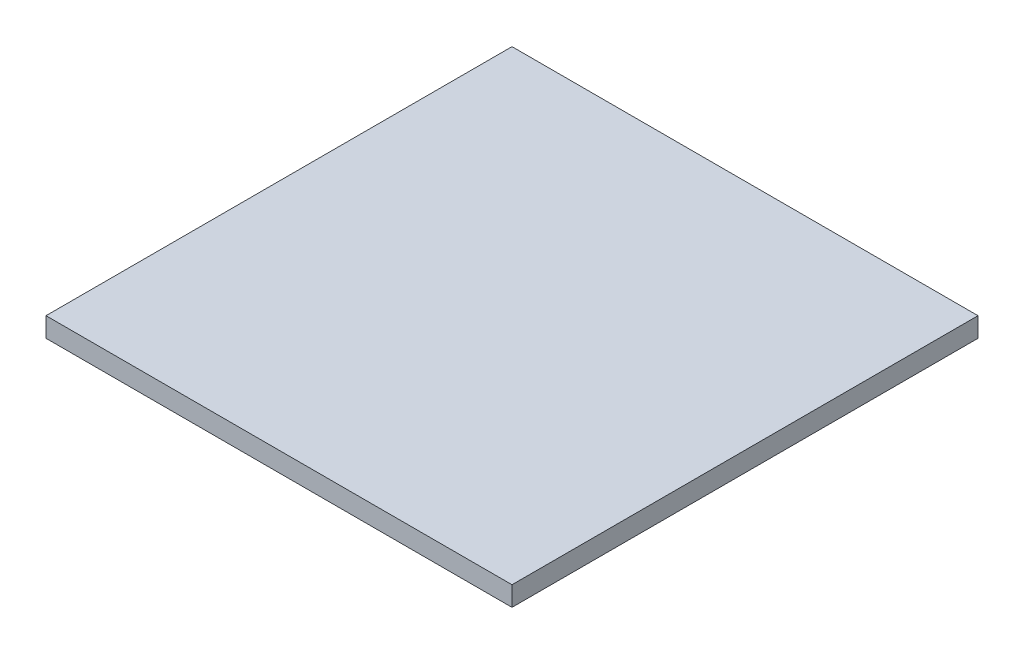
ISO-10303-21;
HEADER;
FILE_DESCRIPTION(('STEP AP214'),'2;1');
FILE_NAME('part.step','',(''),(''),'','','');
FILE_SCHEMA(('AUTOMOTIVE_DESIGN { 1 0 10303 214 1 1 1 1 }'));
ENDSEC;
DATA;
#1=APPLICATION_CONTEXT('core data for automotive mechanical design processes');
#2=APPLICATION_PROTOCOL_DEFINITION('international standard','automotive_design',2000,#1);
#3=PRODUCT_CONTEXT('',#1,'mechanical');
#4=PRODUCT('Part','Part','',(#3));
#5=PRODUCT_RELATED_PRODUCT_CATEGORY('part','',(#4));
#6=PRODUCT_DEFINITION_FORMATION('','',#4);
#7=PRODUCT_DEFINITION_CONTEXT('part definition',#1,'design');
#8=PRODUCT_DEFINITION('design','',#6,#7);
#9=PRODUCT_DEFINITION_SHAPE('','',#8);
#10=(LENGTH_UNIT() NAMED_UNIT(*) SI_UNIT(.MILLI.,.METRE.));
#11=(NAMED_UNIT(*) PLANE_ANGLE_UNIT() SI_UNIT($,.RADIAN.));
#12=(NAMED_UNIT(*) SI_UNIT($,.STERADIAN.) SOLID_ANGLE_UNIT());
#13=UNCERTAINTY_MEASURE_WITH_UNIT(LENGTH_MEASURE(1.E-05),#10,'distance_accuracy_value','');
#14=(GEOMETRIC_REPRESENTATION_CONTEXT(3) GLOBAL_UNCERTAINTY_ASSIGNED_CONTEXT((#13)) GLOBAL_UNIT_ASSIGNED_CONTEXT((#10,
#11,#12)) REPRESENTATION_CONTEXT('',''));
#15=CARTESIAN_POINT('',(0.,0.,0.));
#16=DIRECTION('',(0.,0.,1.));
#17=DIRECTION('',(1.,0.,0.));
#18=AXIS2_PLACEMENT_3D('',#15,#16,#17);
#19=CARTESIAN_POINT('',(0.,0.,0.));
#20=DIRECTION('',(0.,-1.,0.));
#21=DIRECTION('',(0.,0.,-1.));
#22=AXIS2_PLACEMENT_3D('',#19,#20,#21);
#23=PLANE('',#22);
#24=DIRECTION('',(-1.,0.,0.));
#25=VECTOR('',#24,1.);
#26=CARTESIAN_POINT('',(-2.00000000000005,0.,-254.080415622193));
#27=LINE('',#26,#25);
#28=CARTESIAN_POINT('',(402.,0.,-254.080415622193));
#29=VERTEX_POINT('',#28);
#30=CARTESIAN_POINT('',(-2.00000000000005,0.,-254.080415622193));
#31=VERTEX_POINT('',#30);
#32=EDGE_CURVE('E181',#29,#31,#27,.T.);
#33=ORIENTED_EDGE('',*,*,#32,.F.);
#34=DIRECTION('',(0.,0.,-1.));
#35=VECTOR('',#34,1.);
#36=CARTESIAN_POINT('',(402.,0.,-254.080415622193));
#37=LINE('',#36,#35);
#38=CARTESIAN_POINT('',(402.,0.,149.919584377807));
#39=VERTEX_POINT('',#38);
#40=EDGE_CURVE('E65',#39,#29,#37,.T.);
#41=ORIENTED_EDGE('',*,*,#40,.F.);
#42=DIRECTION('',(1.,0.,0.));
#43=VECTOR('',#42,1.);
#44=CARTESIAN_POINT('',(-2.,0.,149.919584377807));
#45=LINE('',#44,#43);
#46=CARTESIAN_POINT('',(-2.,0.,149.919584377807));
#47=VERTEX_POINT('',#46);
#48=EDGE_CURVE('E187',#47,#39,#45,.T.);
#49=ORIENTED_EDGE('',*,*,#48,.F.);
#50=DIRECTION('',(0.,0.,1.));
#51=VECTOR('',#50,1.);
#52=CARTESIAN_POINT('',(-2.00000000000005,0.,-254.080415622193));
#53=LINE('',#52,#51);
#54=EDGE_CURVE('E114',#31,#47,#53,.T.);
#55=ORIENTED_EDGE('',*,*,#54,.F.);
#56=EDGE_LOOP('',(#33,#41,#49,#55));
#57=FACE_BOUND('',#56,.T.);
#58=DIRECTION('',(-1.,0.,0.));
#59=VECTOR('',#58,1.);
#60=CARTESIAN_POINT('',(0.,0.,-252.080415622193));
#61=LINE('',#60,#59);
#62=CARTESIAN_POINT('',(400.,0.,-252.080415622193));
#63=VERTEX_POINT('',#62);
#64=CARTESIAN_POINT('',(0.,0.,-252.080415622193));
#65=VERTEX_POINT('',#64);
#66=EDGE_CURVE('E144',#63,#65,#61,.T.);
#67=ORIENTED_EDGE('',*,*,#66,.T.);
#68=DIRECTION('',(0.,0.,1.));
#69=VECTOR('',#68,1.);
#70=CARTESIAN_POINT('',(0.,0.,-252.080415622193));
#71=LINE('',#70,#69);
#72=CARTESIAN_POINT('',(0.,0.,147.919584377807));
#73=VERTEX_POINT('',#72);
#74=EDGE_CURVE('E57',#65,#73,#71,.T.);
#75=ORIENTED_EDGE('',*,*,#74,.T.);
#76=DIRECTION('',(1.,0.,0.));
#77=VECTOR('',#76,1.);
#78=CARTESIAN_POINT('',(0.,0.,147.919584377807));
#79=LINE('',#78,#77);
#80=CARTESIAN_POINT('',(400.,0.,147.919584377807));
#81=VERTEX_POINT('',#80);
#82=EDGE_CURVE('E159',#73,#81,#79,.T.);
#83=ORIENTED_EDGE('',*,*,#82,.T.);
#84=DIRECTION('',(0.,0.,-1.));
#85=VECTOR('',#84,1.);
#86=CARTESIAN_POINT('',(400.,0.,-252.080415622193));
#87=LINE('',#86,#85);
#88=EDGE_CURVE('E163',#81,#63,#87,.T.);
#89=ORIENTED_EDGE('',*,*,#88,.T.);
#90=EDGE_LOOP('',(#67,#75,#83,#89));
#91=FACE_BOUND('',#90,.T.);
#92=ADVANCED_FACE('F41',(#57,#91),#23,.T.);
#93=CARTESIAN_POINT('',(-2.00000000000005,15.,-254.080415622193));
#94=DIRECTION('',(0.,0.,1.));
#95=DIRECTION('',(1.,0.,0.));
#96=AXIS2_PLACEMENT_3D('',#93,#94,#95);
#97=PLANE('',#96);
#98=ORIENTED_EDGE('',*,*,#32,.T.);
#99=DIRECTION('',(0.,-1.,0.));
#100=VECTOR('',#99,1.);
#101=CARTESIAN_POINT('',(-2.00000000000005,15.,-254.080415622193));
#102=LINE('',#101,#100);
#103=CARTESIAN_POINT('',(-2.00000000000005,17.,-254.080415622193));
#104=VERTEX_POINT('',#103);
#105=EDGE_CURVE('E11',#104,#31,#102,.T.);
#106=ORIENTED_EDGE('',*,*,#105,.F.);
#107=DIRECTION('',(-1.,0.,0.));
#108=VECTOR('',#107,1.);
#109=CARTESIAN_POINT('',(-2.00000000000005,17.,-254.080415622193));
#110=LINE('',#109,#108);
#111=CARTESIAN_POINT('',(402.,17.,-254.080415622193));
#112=VERTEX_POINT('',#111);
#113=EDGE_CURVE('E131',#112,#104,#110,.T.);
#114=ORIENTED_EDGE('',*,*,#113,.F.);
#115=DIRECTION('',(0.,-1.,0.));
#116=VECTOR('',#115,1.);
#117=CARTESIAN_POINT('',(402.,15.,-254.080415622193));
#118=LINE('',#117,#116);
#119=EDGE_CURVE('E192',#112,#29,#118,.T.);
#120=ORIENTED_EDGE('',*,*,#119,.T.);
#121=EDGE_LOOP('',(#98,#106,#114,#120));
#122=FACE_BOUND('',#121,.T.);
#123=ADVANCED_FACE('F43',(#122),#97,.F.);
#124=CARTESIAN_POINT('',(-2.00000000000005,15.,-254.080415622193));
#125=DIRECTION('',(1.,0.,0.));
#126=DIRECTION('',(0.,0.,-1.));
#127=AXIS2_PLACEMENT_3D('',#124,#125,#126);
#128=PLANE('',#127);
#129=ORIENTED_EDGE('',*,*,#54,.T.);
#130=DIRECTION('',(0.,-1.,0.));
#131=VECTOR('',#130,1.);
#132=CARTESIAN_POINT('',(-2.,15.,149.919584377807));
#133=LINE('',#132,#131);
#134=CARTESIAN_POINT('',(-2.,17.,149.919584377807));
#135=VERTEX_POINT('',#134);
#136=EDGE_CURVE('E50',#135,#47,#133,.T.);
#137=ORIENTED_EDGE('',*,*,#136,.F.);
#138=DIRECTION('',(0.,0.,1.));
#139=VECTOR('',#138,1.);
#140=CARTESIAN_POINT('',(-2.00000000000005,17.,-254.080415622193));
#141=LINE('',#140,#139);
#142=EDGE_CURVE('E113',#104,#135,#141,.T.);
#143=ORIENTED_EDGE('',*,*,#142,.F.);
#144=ORIENTED_EDGE('',*,*,#105,.T.);
#145=EDGE_LOOP('',(#129,#137,#143,#144));
#146=FACE_BOUND('',#145,.T.);
#147=ADVANCED_FACE('F111',(#146),#128,.F.);
#148=CARTESIAN_POINT('',(-2.,15.,149.919584377807));
#149=DIRECTION('',(0.,0.,-1.));
#150=DIRECTION('',(-1.,0.,0.));
#151=AXIS2_PLACEMENT_3D('',#148,#149,#150);
#152=PLANE('',#151);
#153=ORIENTED_EDGE('',*,*,#48,.T.);
#154=DIRECTION('',(0.,-1.,0.));
#155=VECTOR('',#154,1.);
#156=CARTESIAN_POINT('',(402.,15.,149.919584377807));
#157=LINE('',#156,#155);
#158=CARTESIAN_POINT('',(402.,17.,149.919584377807));
#159=VERTEX_POINT('',#158);
#160=EDGE_CURVE('E118',#159,#39,#157,.T.);
#161=ORIENTED_EDGE('',*,*,#160,.F.);
#162=DIRECTION('',(1.,0.,0.));
#163=VECTOR('',#162,1.);
#164=CARTESIAN_POINT('',(-2.,17.,149.919584377807));
#165=LINE('',#164,#163);
#166=EDGE_CURVE('E120',#135,#159,#165,.T.);
#167=ORIENTED_EDGE('',*,*,#166,.F.);
#168=ORIENTED_EDGE('',*,*,#136,.T.);
#169=EDGE_LOOP('',(#153,#161,#167,#168));
#170=FACE_BOUND('',#169,.T.);
#171=ADVANCED_FACE('F121',(#170),#152,.F.);
#172=CARTESIAN_POINT('',(402.,15.,-254.080415622193));
#173=DIRECTION('',(-1.,0.,0.));
#174=DIRECTION('',(0.,0.,1.));
#175=AXIS2_PLACEMENT_3D('',#172,#173,#174);
#176=PLANE('',#175);
#177=ORIENTED_EDGE('',*,*,#40,.T.);
#178=ORIENTED_EDGE('',*,*,#119,.F.);
#179=DIRECTION('',(0.,0.,-1.));
#180=VECTOR('',#179,1.);
#181=CARTESIAN_POINT('',(402.,17.,-254.080415622193));
#182=LINE('',#181,#180);
#183=EDGE_CURVE('E126',#159,#112,#182,.T.);
#184=ORIENTED_EDGE('',*,*,#183,.F.);
#185=ORIENTED_EDGE('',*,*,#160,.T.);
#186=EDGE_LOOP('',(#177,#178,#184,#185));
#187=FACE_BOUND('',#186,.T.);
#188=ADVANCED_FACE('F196',(#187),#176,.F.);
#189=CARTESIAN_POINT('',(0.,15.,-252.080415622193));
#190=DIRECTION('',(1.,0.,0.));
#191=DIRECTION('',(0.,0.,-1.));
#192=AXIS2_PLACEMENT_3D('',#189,#190,#191);
#193=PLANE('',#192);
#194=ORIENTED_EDGE('',*,*,#74,.F.);
#195=DIRECTION('',(0.,-1.,0.));
#196=VECTOR('',#195,1.);
#197=CARTESIAN_POINT('',(0.,15.,-252.080415622193));
#198=LINE('',#197,#196);
#199=CARTESIAN_POINT('',(0.,15.,-252.080415622193));
#200=VERTEX_POINT('',#199);
#201=EDGE_CURVE('E156',#200,#65,#198,.T.);
#202=ORIENTED_EDGE('',*,*,#201,.F.);
#203=DIRECTION('',(0.,0.,1.));
#204=VECTOR('',#203,1.);
#205=CARTESIAN_POINT('',(0.,15.,-252.080415622193));
#206=LINE('',#205,#204);
#207=CARTESIAN_POINT('',(0.,15.,147.919584377807));
#208=VERTEX_POINT('',#207);
#209=EDGE_CURVE('E139',#200,#208,#206,.T.);
#210=ORIENTED_EDGE('',*,*,#209,.T.);
#211=DIRECTION('',(0.,-1.,0.));
#212=VECTOR('',#211,1.);
#213=CARTESIAN_POINT('',(0.,15.,147.919584377807));
#214=LINE('',#213,#212);
#215=EDGE_CURVE('E178',#208,#73,#214,.T.);
#216=ORIENTED_EDGE('',*,*,#215,.T.);
#217=EDGE_LOOP('',(#194,#202,#210,#216));
#218=FACE_BOUND('',#217,.T.);
#219=ADVANCED_FACE('F211',(#218),#193,.T.);
#220=CARTESIAN_POINT('',(0.,15.,147.919584377807));
#221=DIRECTION('',(0.,0.,-1.));
#222=DIRECTION('',(-1.,0.,0.));
#223=AXIS2_PLACEMENT_3D('',#220,#221,#222);
#224=PLANE('',#223);
#225=ORIENTED_EDGE('',*,*,#82,.F.);
#226=ORIENTED_EDGE('',*,*,#215,.F.);
#227=DIRECTION('',(1.,0.,0.));
#228=VECTOR('',#227,1.);
#229=CARTESIAN_POINT('',(0.,15.,147.919584377807));
#230=LINE('',#229,#228);
#231=CARTESIAN_POINT('',(400.,15.,147.919584377807));
#232=VERTEX_POINT('',#231);
#233=EDGE_CURVE('E143',#208,#232,#230,.T.);
#234=ORIENTED_EDGE('',*,*,#233,.T.);
#235=DIRECTION('',(0.,-1.,0.));
#236=VECTOR('',#235,1.);
#237=CARTESIAN_POINT('',(400.,15.,147.919584377807));
#238=LINE('',#237,#236);
#239=EDGE_CURVE('E175',#232,#81,#238,.T.);
#240=ORIENTED_EDGE('',*,*,#239,.T.);
#241=EDGE_LOOP('',(#225,#226,#234,#240));
#242=FACE_BOUND('',#241,.T.);
#243=ADVANCED_FACE('F230',(#242),#224,.T.);
#244=CARTESIAN_POINT('',(400.,15.,-252.080415622193));
#245=DIRECTION('',(-1.,0.,0.));
#246=DIRECTION('',(0.,0.,1.));
#247=AXIS2_PLACEMENT_3D('',#244,#245,#246);
#248=PLANE('',#247);
#249=ORIENTED_EDGE('',*,*,#88,.F.);
#250=ORIENTED_EDGE('',*,*,#239,.F.);
#251=DIRECTION('',(0.,0.,-1.));
#252=VECTOR('',#251,1.);
#253=CARTESIAN_POINT('',(400.,15.,-252.080415622193));
#254=LINE('',#253,#252);
#255=CARTESIAN_POINT('',(400.,15.,-252.080415622193));
#256=VERTEX_POINT('',#255);
#257=EDGE_CURVE('E148',#232,#256,#254,.T.);
#258=ORIENTED_EDGE('',*,*,#257,.T.);
#259=DIRECTION('',(0.,-1.,0.));
#260=VECTOR('',#259,1.);
#261=CARTESIAN_POINT('',(400.,15.,-252.080415622193));
#262=LINE('',#261,#260);
#263=EDGE_CURVE('E172',#256,#63,#262,.T.);
#264=ORIENTED_EDGE('',*,*,#263,.T.);
#265=EDGE_LOOP('',(#249,#250,#258,#264));
#266=FACE_BOUND('',#265,.T.);
#267=ADVANCED_FACE('F236',(#266),#248,.T.);
#268=CARTESIAN_POINT('',(0.,15.,-252.080415622193));
#269=DIRECTION('',(0.,0.,1.));
#270=DIRECTION('',(1.,0.,0.));
#271=AXIS2_PLACEMENT_3D('',#268,#269,#270);
#272=PLANE('',#271);
#273=ORIENTED_EDGE('',*,*,#66,.F.);
#274=ORIENTED_EDGE('',*,*,#263,.F.);
#275=DIRECTION('',(-1.,0.,0.));
#276=VECTOR('',#275,1.);
#277=CARTESIAN_POINT('',(0.,15.,-252.080415622193));
#278=LINE('',#277,#276);
#279=EDGE_CURVE('E152',#256,#200,#278,.T.);
#280=ORIENTED_EDGE('',*,*,#279,.T.);
#281=ORIENTED_EDGE('',*,*,#201,.T.);
#282=EDGE_LOOP('',(#273,#274,#280,#281));
#283=FACE_BOUND('',#282,.T.);
#284=ADVANCED_FACE('F243',(#283),#272,.T.);
#285=CARTESIAN_POINT('',(0.,15.,0.));
#286=DIRECTION('',(0.,1.,0.));
#287=DIRECTION('',(0.,0.,1.));
#288=AXIS2_PLACEMENT_3D('',#285,#286,#287);
#289=PLANE('',#288);
#290=ORIENTED_EDGE('',*,*,#209,.F.);
#291=ORIENTED_EDGE('',*,*,#279,.F.);
#292=ORIENTED_EDGE('',*,*,#257,.F.);
#293=ORIENTED_EDGE('',*,*,#233,.F.);
#294=EDGE_LOOP('',(#290,#291,#292,#293));
#295=FACE_BOUND('',#294,.T.);
#296=ADVANCED_FACE('F251',(#295),#289,.F.);
#297=CARTESIAN_POINT('',(0.,17.,0.));
#298=DIRECTION('',(0.,1.,0.));
#299=DIRECTION('',(0.,0.,1.));
#300=AXIS2_PLACEMENT_3D('',#297,#298,#299);
#301=PLANE('',#300);
#302=ORIENTED_EDGE('',*,*,#142,.T.);
#303=ORIENTED_EDGE('',*,*,#166,.T.);
#304=ORIENTED_EDGE('',*,*,#183,.T.);
#305=ORIENTED_EDGE('',*,*,#113,.T.);
#306=EDGE_LOOP('',(#302,#303,#304,#305));
#307=FACE_BOUND('',#306,.T.);
#308=ADVANCED_FACE('F129',(#307),#301,.T.);
#309=CLOSED_SHELL('',(#92,#123,#147,#171,#188,#219,#243,#267,#284,#296,#308));
#310=MANIFOLD_SOLID_BREP('B2',#309);
#311=ADVANCED_BREP_SHAPE_REPRESENTATION('',(#18,#310),#14);
#312=SHAPE_DEFINITION_REPRESENTATION(#9,#311);
ENDSEC;
END-ISO-10303-21;
